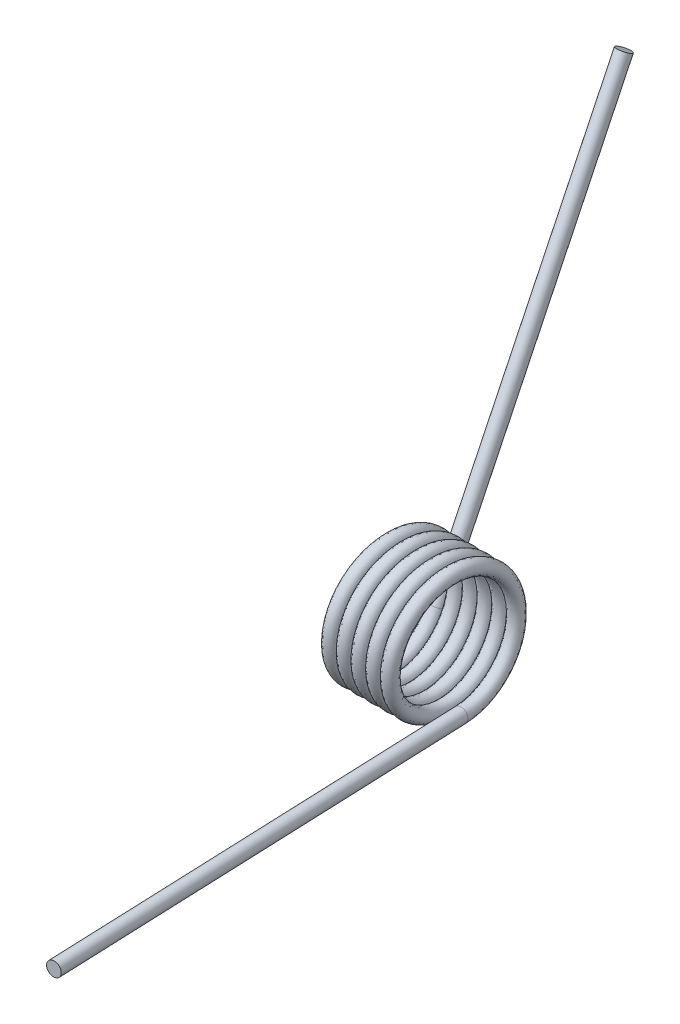
ISO-10303-21;
HEADER;
FILE_DESCRIPTION(('STEP AP214'),'2;1');
FILE_NAME('part.step','',(''),(''),'','','');
FILE_SCHEMA(('AUTOMOTIVE_DESIGN { 1 0 10303 214 1 1 1 1 }'));
ENDSEC;
DATA;
#1=APPLICATION_CONTEXT('core data for automotive mechanical design processes');
#2=APPLICATION_PROTOCOL_DEFINITION('international standard','automotive_design',2000,#1);
#3=PRODUCT_CONTEXT('',#1,'mechanical');
#4=PRODUCT('Part','Part','',(#3));
#5=PRODUCT_RELATED_PRODUCT_CATEGORY('part','',(#4));
#6=PRODUCT_DEFINITION_FORMATION('','',#4);
#7=PRODUCT_DEFINITION_CONTEXT('part definition',#1,'design');
#8=PRODUCT_DEFINITION('design','',#6,#7);
#9=PRODUCT_DEFINITION_SHAPE('','',#8);
#10=(LENGTH_UNIT() NAMED_UNIT(*) SI_UNIT(.MILLI.,.METRE.));
#11=(NAMED_UNIT(*) PLANE_ANGLE_UNIT() SI_UNIT($,.RADIAN.));
#12=(NAMED_UNIT(*) SI_UNIT($,.STERADIAN.) SOLID_ANGLE_UNIT());
#13=UNCERTAINTY_MEASURE_WITH_UNIT(LENGTH_MEASURE(1.E-05),#10,'distance_accuracy_value','');
#14=(GEOMETRIC_REPRESENTATION_CONTEXT(3) GLOBAL_UNCERTAINTY_ASSIGNED_CONTEXT((#13)) GLOBAL_UNIT_ASSIGNED_CONTEXT((#10,
#11,#12)) REPRESENTATION_CONTEXT('',''));
#15=CARTESIAN_POINT('',(0.,0.,0.));
#16=DIRECTION('',(0.,0.,1.));
#17=DIRECTION('',(1.,0.,0.));
#18=AXIS2_PLACEMENT_3D('',#15,#16,#17);
#19=CARTESIAN_POINT('',(-0.317253727132407,-2.667,0.0125029044863882));
#20=CARTESIAN_POINT('',(-0.37228706046574,-2.67421855527087,-1.52729026344234));
#21=CARTESIAN_POINT('',(-0.427320393799073,-1.3443278329063,-2.30343829964991));
#22=CARTESIAN_POINT('',(-0.482353727132406,-0.014437110541737,-3.07958633585747));
#23=CARTESIAN_POINT('',(-0.537387060465739,1.3226721670937,-2.31594120413629));
#24=CARTESIAN_POINT('',(-0.592420393799073,2.65978144472913,-1.55229607241512));
#25=CARTESIAN_POINT('',(-0.647453727132406,2.667,-0.0125029044863885));
#26=CARTESIAN_POINT('',(-0.702487060465739,2.67421855527087,1.52729026344234));
#27=CARTESIAN_POINT('',(-0.757520393799072,1.34432783290631,2.30343829964991));
#28=CARTESIAN_POINT('',(-0.812553727132405,0.0144371105417374,3.07958633585747));
#29=CARTESIAN_POINT('',(-0.867587060465739,-1.3226721670937,2.3159412041363));
#30=CARTESIAN_POINT('',(-0.922620393799072,-2.65978144472913,1.55229607241512));
#31=CARTESIAN_POINT('',(-0.977653727132405,-2.667,0.0125029044863882));
#32=CARTESIAN_POINT('',(-1.03268706046574,-2.67421855527087,-1.52729026344234));
#33=CARTESIAN_POINT('',(-1.08772039379907,-1.3443278329063,-2.30343829964991));
#34=CARTESIAN_POINT('',(-1.1427537271324,-0.014437110541737,-3.07958633585747));
#35=CARTESIAN_POINT('',(-1.19778706046574,1.3226721670937,-2.31594120413629));
#36=CARTESIAN_POINT('',(-1.25282039379907,2.65978144472913,-1.55229607241512));
#37=CARTESIAN_POINT('',(-1.3078537271324,2.667,-0.0125029044863885));
#38=CARTESIAN_POINT('',(-1.36288706046574,2.67421855527087,1.52729026344234));
#39=CARTESIAN_POINT('',(-1.41792039379907,1.34432783290631,2.30343829964991));
#40=CARTESIAN_POINT('',(-1.4729537271324,0.0144371105417374,3.07958633585747));
#41=CARTESIAN_POINT('',(-1.52798706046574,-1.3226721670937,2.3159412041363));
#42=CARTESIAN_POINT('',(-1.58302039379907,-2.65978144472913,1.55229607241512));
#43=CARTESIAN_POINT('',(-1.6380537271324,-2.667,0.0125029044863882));
#44=CARTESIAN_POINT('',(-1.69308706046574,-2.67421855527087,-1.52729026344234));
#45=CARTESIAN_POINT('',(-1.74812039379907,-1.3443278329063,-2.30343829964991));
#46=CARTESIAN_POINT('',(-1.8031537271324,-0.014437110541737,-3.07958633585747));
#47=CARTESIAN_POINT('',(-1.85818706046574,1.3226721670937,-2.31594120413629));
#48=CARTESIAN_POINT('',(-1.91322039379907,2.65978144472913,-1.55229607241512));
#49=CARTESIAN_POINT('',(-1.9682537271324,2.667,-0.0125029044863885));
#50=CARTESIAN_POINT('',(-2.02328706046574,2.67421855527087,1.52729026344234));
#51=CARTESIAN_POINT('',(-2.07832039379907,1.34432783290631,2.30343829964991));
#52=CARTESIAN_POINT('',(-2.1333537271324,0.0144371105417374,3.07958633585747));
#53=CARTESIAN_POINT('',(-2.18838706046574,-1.3226721670937,2.3159412041363));
#54=CARTESIAN_POINT('',(-2.24342039379907,-2.65978144472913,1.55229607241512));
#55=CARTESIAN_POINT('',(-2.2984537271324,-2.667,0.0125029044863882));
#56=CARTESIAN_POINT('',(-2.35348706046574,-2.67421855527087,-1.52729026344234));
#57=CARTESIAN_POINT('',(-2.40852039379907,-1.3443278329063,-2.30343829964991));
#58=CARTESIAN_POINT('',(-2.4635537271324,-0.014437110541737,-3.07958633585747));
#59=CARTESIAN_POINT('',(-2.51858706046573,1.3226721670937,-2.31594120413629));
#60=CARTESIAN_POINT('',(-2.57362039379907,2.65978144472913,-1.55229607241512));
#61=CARTESIAN_POINT('',(-2.6286537271324,2.667,-0.0125029044863885));
#62=CARTESIAN_POINT('',(-2.68368706046573,2.67421855527087,1.52729026344234));
#63=CARTESIAN_POINT('',(-2.73872039379907,1.34432783290631,2.30343829964991));
#64=CARTESIAN_POINT('',(-2.7937537271324,0.0144371105417374,3.07958633585747));
#65=CARTESIAN_POINT('',(-2.84878706046573,-1.3226721670937,2.3159412041363));
#66=CARTESIAN_POINT('',(-2.90382039379907,-2.65978144472913,1.55229607241512));
#67=CARTESIAN_POINT('',(-2.9588537271324,-2.667,0.0125029044863882));
#68=CARTESIAN_POINT('',(-3.01388706046573,-2.67421855527087,-1.52729026344234));
#69=CARTESIAN_POINT('',(-3.06892039379907,-1.3443278329063,-2.30343829964991));
#70=CARTESIAN_POINT('',(-3.1239537271324,-0.014437110541737,-3.07958633585747));
#71=CARTESIAN_POINT('',(-3.17898706046573,1.3226721670937,-2.31594120413629));
#72=CARTESIAN_POINT('',(-3.23402039379907,2.65978144472913,-1.55229607241512));
#73=CARTESIAN_POINT('',(-3.2890537271324,2.667,-0.0125029044863885));
#74=CARTESIAN_POINT('',(-3.34408706046573,2.67421855527087,1.52729026344234));
#75=CARTESIAN_POINT('',(-3.39912039379907,1.34432783290631,2.30343829964991));
#76=CARTESIAN_POINT('',(-3.4541537271324,0.0144371105417374,3.07958633585747));
#77=CARTESIAN_POINT('',(-3.50918706046573,-1.3226721670937,2.3159412041363));
#78=CARTESIAN_POINT('',(-3.56422039379907,-2.65978144472913,1.55229607241512));
#79=CARTESIAN_POINT('',(-3.6192537271324,-2.667,0.0125029044863882));
#80=CARTESIAN_POINT('',(-3.67428706046573,-2.67421855527087,-1.52729026344234));
#81=CARTESIAN_POINT('',(-3.72932039379906,-1.3443278329063,-2.30343829964991));
#82=CARTESIAN_POINT('',(-3.7843537271324,-0.014437110541737,-3.07958633585747));
#83=CARTESIAN_POINT('',(-3.83938706046573,1.3226721670937,-2.31594120413629));
#84=CARTESIAN_POINT('',(-3.89442039379906,2.65978144472913,-1.55229607241512));
#85=CARTESIAN_POINT('',(-3.9494537271324,2.667,-0.0125029044863885));
#86=CARTESIAN_POINT('',(-4.00448706046573,2.67421855527087,1.52729026344234));
#87=CARTESIAN_POINT('',(-4.05952039379906,1.34432783290631,2.30343829964991));
#88=CARTESIAN_POINT('',(-4.1145537271324,0.0144371105417374,3.07958633585747));
#89=CARTESIAN_POINT('',(-4.16958706046573,-1.3226721670937,2.3159412041363));
#90=CARTESIAN_POINT('',(-4.22462039379906,-2.65978144472913,1.55229607241512));
#91=CARTESIAN_POINT('',(-4.2796537271324,-2.667,0.0125029044863882));
#92=CARTESIAN_POINT('',(-0.317253727132406,-2.032,0.0125029044863945));
#93=CARTESIAN_POINT('',(-0.37228706046574,-2.03921855527087,-1.16067284250693));
#94=CARTESIAN_POINT('',(-0.427320393799073,-1.02682783290631,-1.75351216824678));
#95=CARTESIAN_POINT('',(-0.482353727132406,-0.0144371105417442,-2.34635149398664));
#96=CARTESIAN_POINT('',(-0.537387060465739,1.00517216709369,-1.76601507273318));
#97=CARTESIAN_POINT('',(-0.592420393799072,2.02478144472913,-1.18567865147972));
#98=CARTESIAN_POINT('',(-0.647453727132406,2.032,-0.0125029044863947));
#99=CARTESIAN_POINT('',(-0.702487060465739,2.03921855527088,1.16067284250693));
#100=CARTESIAN_POINT('',(-0.757520393799072,1.02682783290631,1.75351216824678));
#101=CARTESIAN_POINT('',(-0.812553727132405,0.0144371105417445,2.34635149398664));
#102=CARTESIAN_POINT('',(-0.867587060465738,-1.00517216709369,1.76601507273318));
#103=CARTESIAN_POINT('',(-0.922620393799072,-2.02478144472913,1.18567865147972));
#104=CARTESIAN_POINT('',(-0.977653727132405,-2.032,0.0125029044863945));
#105=CARTESIAN_POINT('',(-1.03268706046574,-2.03921855527087,-1.16067284250693));
#106=CARTESIAN_POINT('',(-1.08772039379907,-1.02682783290631,-1.75351216824678));
#107=CARTESIAN_POINT('',(-1.1427537271324,-0.0144371105417442,-2.34635149398664));
#108=CARTESIAN_POINT('',(-1.19778706046574,1.00517216709369,-1.76601507273318));
#109=CARTESIAN_POINT('',(-1.25282039379907,2.02478144472913,-1.18567865147972));
#110=CARTESIAN_POINT('',(-1.3078537271324,2.032,-0.0125029044863947));
#111=CARTESIAN_POINT('',(-1.36288706046574,2.03921855527088,1.16067284250693));
#112=CARTESIAN_POINT('',(-1.41792039379907,1.02682783290631,1.75351216824678));
#113=CARTESIAN_POINT('',(-1.4729537271324,0.0144371105417445,2.34635149398664));
#114=CARTESIAN_POINT('',(-1.52798706046574,-1.00517216709369,1.76601507273318));
#115=CARTESIAN_POINT('',(-1.58302039379907,-2.02478144472913,1.18567865147972));
#116=CARTESIAN_POINT('',(-1.6380537271324,-2.032,0.0125029044863945));
#117=CARTESIAN_POINT('',(-1.69308706046574,-2.03921855527087,-1.16067284250693));
#118=CARTESIAN_POINT('',(-1.74812039379907,-1.02682783290631,-1.75351216824678));
#119=CARTESIAN_POINT('',(-1.8031537271324,-0.0144371105417442,-2.34635149398664));
#120=CARTESIAN_POINT('',(-1.85818706046574,1.00517216709369,-1.76601507273318));
#121=CARTESIAN_POINT('',(-1.91322039379907,2.02478144472913,-1.18567865147972));
#122=CARTESIAN_POINT('',(-1.9682537271324,2.032,-0.0125029044863947));
#123=CARTESIAN_POINT('',(-2.02328706046574,2.03921855527088,1.16067284250693));
#124=CARTESIAN_POINT('',(-2.07832039379907,1.02682783290631,1.75351216824678));
#125=CARTESIAN_POINT('',(-2.1333537271324,0.0144371105417445,2.34635149398664));
#126=CARTESIAN_POINT('',(-2.18838706046574,-1.00517216709369,1.76601507273318));
#127=CARTESIAN_POINT('',(-2.24342039379907,-2.02478144472913,1.18567865147972));
#128=CARTESIAN_POINT('',(-2.2984537271324,-2.032,0.0125029044863945));
#129=CARTESIAN_POINT('',(-2.35348706046574,-2.03921855527087,-1.16067284250693));
#130=CARTESIAN_POINT('',(-2.40852039379907,-1.02682783290631,-1.75351216824678));
#131=CARTESIAN_POINT('',(-2.4635537271324,-0.0144371105417442,-2.34635149398664));
#132=CARTESIAN_POINT('',(-2.51858706046573,1.00517216709369,-1.76601507273318));
#133=CARTESIAN_POINT('',(-2.57362039379907,2.02478144472913,-1.18567865147972));
#134=CARTESIAN_POINT('',(-2.6286537271324,2.032,-0.0125029044863947));
#135=CARTESIAN_POINT('',(-2.68368706046573,2.03921855527088,1.16067284250693));
#136=CARTESIAN_POINT('',(-2.73872039379907,1.02682783290631,1.75351216824678));
#137=CARTESIAN_POINT('',(-2.7937537271324,0.0144371105417445,2.34635149398664));
#138=CARTESIAN_POINT('',(-2.84878706046573,-1.00517216709369,1.76601507273318));
#139=CARTESIAN_POINT('',(-2.90382039379907,-2.02478144472913,1.18567865147972));
#140=CARTESIAN_POINT('',(-2.9588537271324,-2.032,0.0125029044863945));
#141=CARTESIAN_POINT('',(-3.01388706046573,-2.03921855527087,-1.16067284250693));
#142=CARTESIAN_POINT('',(-3.06892039379907,-1.02682783290631,-1.75351216824678));
#143=CARTESIAN_POINT('',(-3.1239537271324,-0.0144371105417442,-2.34635149398664));
#144=CARTESIAN_POINT('',(-3.17898706046573,1.00517216709369,-1.76601507273318));
#145=CARTESIAN_POINT('',(-3.23402039379907,2.02478144472913,-1.18567865147972));
#146=CARTESIAN_POINT('',(-3.2890537271324,2.032,-0.0125029044863947));
#147=CARTESIAN_POINT('',(-3.34408706046573,2.03921855527088,1.16067284250693));
#148=CARTESIAN_POINT('',(-3.39912039379907,1.02682783290631,1.75351216824678));
#149=CARTESIAN_POINT('',(-3.4541537271324,0.0144371105417445,2.34635149398664));
#150=CARTESIAN_POINT('',(-3.50918706046573,-1.00517216709369,1.76601507273318));
#151=CARTESIAN_POINT('',(-3.56422039379906,-2.02478144472913,1.18567865147972));
#152=CARTESIAN_POINT('',(-3.6192537271324,-2.032,0.0125029044863945));
#153=CARTESIAN_POINT('',(-3.67428706046573,-2.03921855527087,-1.16067284250693));
#154=CARTESIAN_POINT('',(-3.72932039379906,-1.02682783290631,-1.75351216824678));
#155=CARTESIAN_POINT('',(-3.7843537271324,-0.0144371105417442,-2.34635149398664));
#156=CARTESIAN_POINT('',(-3.83938706046573,1.00517216709369,-1.76601507273318));
#157=CARTESIAN_POINT('',(-3.89442039379906,2.02478144472913,-1.18567865147972));
#158=CARTESIAN_POINT('',(-3.9494537271324,2.032,-0.0125029044863947));
#159=CARTESIAN_POINT('',(-4.00448706046573,2.03921855527088,1.16067284250693));
#160=CARTESIAN_POINT('',(-4.05952039379906,1.02682783290631,1.75351216824678));
#161=CARTESIAN_POINT('',(-4.1145537271324,0.0144371105417445,2.34635149398664));
#162=CARTESIAN_POINT('',(-4.16958706046573,-1.00517216709369,1.76601507273318));
#163=CARTESIAN_POINT('',(-4.22462039379906,-2.02478144472913,1.18567865147972));
#164=CARTESIAN_POINT('',(-4.2796537271324,-2.032,0.0125029044863945));
#165=CARTESIAN_POINT('',(0.317253727132407,-2.032,-0.0125029044864378));
#166=CARTESIAN_POINT('',(0.262220393799074,-2.02478144472911,-1.18567865147976));
#167=CARTESIAN_POINT('',(0.207187060465741,-1.00517216709366,-1.7660150727332));
#168=CARTESIAN_POINT('',(0.152153727132407,0.0144371105417939,-2.34635149398664));
#169=CARTESIAN_POINT('',(0.0971203937990741,1.02682783290635,-1.75351216824676));
#170=CARTESIAN_POINT('',(0.0420870604657409,2.0392185552709,-1.16067284250688));
#171=CARTESIAN_POINT('',(-0.0129462728675923,2.032,0.0125029044864375));
#172=CARTESIAN_POINT('',(-0.0679796062009255,2.02478144472911,1.18567865147976));
#173=CARTESIAN_POINT('',(-0.123012939534259,1.00517216709366,1.7660150727332));
#174=CARTESIAN_POINT('',(-0.178046272867592,-0.0144371105417936,2.34635149398664));
#175=CARTESIAN_POINT('',(-0.233079606200925,-1.02682783290635,1.75351216824676));
#176=CARTESIAN_POINT('',(-0.288112939534258,-2.0392185552709,1.16067284250688));
#177=CARTESIAN_POINT('',(-0.343146272867591,-2.032,-0.0125029044864378));
#178=CARTESIAN_POINT('',(-0.398179606200925,-2.02478144472911,-1.18567865147976));
#179=CARTESIAN_POINT('',(-0.453212939534258,-1.00517216709366,-1.7660150727332));
#180=CARTESIAN_POINT('',(-0.508246272867591,0.0144371105417939,-2.34635149398664));
#181=CARTESIAN_POINT('',(-0.563279606200924,1.02682783290635,-1.75351216824676));
#182=CARTESIAN_POINT('',(-0.618312939534257,2.0392185552709,-1.16067284250688));
#183=CARTESIAN_POINT('',(-0.673346272867591,2.032,0.0125029044864375));
#184=CARTESIAN_POINT('',(-0.728379606200924,2.02478144472911,1.18567865147976));
#185=CARTESIAN_POINT('',(-0.783412939534257,1.00517216709366,1.7660150727332));
#186=CARTESIAN_POINT('',(-0.83844627286759,-0.0144371105417936,2.34635149398664));
#187=CARTESIAN_POINT('',(-0.893479606200923,-1.02682783290635,1.75351216824676));
#188=CARTESIAN_POINT('',(-0.948512939534257,-2.0392185552709,1.16067284250688));
#189=CARTESIAN_POINT('',(-1.00354627286759,-2.032,-0.0125029044864378));
#190=CARTESIAN_POINT('',(-1.05857960620092,-2.02478144472911,-1.18567865147976));
#191=CARTESIAN_POINT('',(-1.11361293953426,-1.00517216709366,-1.7660150727332));
#192=CARTESIAN_POINT('',(-1.16864627286759,0.0144371105417939,-2.34635149398664));
#193=CARTESIAN_POINT('',(-1.22367960620092,1.02682783290635,-1.75351216824676));
#194=CARTESIAN_POINT('',(-1.27871293953426,2.0392185552709,-1.16067284250688));
#195=CARTESIAN_POINT('',(-1.33374627286759,2.032,0.0125029044864375));
#196=CARTESIAN_POINT('',(-1.38877960620092,2.02478144472911,1.18567865147976));
#197=CARTESIAN_POINT('',(-1.44381293953426,1.00517216709366,1.7660150727332));
#198=CARTESIAN_POINT('',(-1.49884627286759,-0.0144371105417936,2.34635149398664));
#199=CARTESIAN_POINT('',(-1.55387960620092,-1.02682783290635,1.75351216824676));
#200=CARTESIAN_POINT('',(-1.60891293953426,-2.0392185552709,1.16067284250688));
#201=CARTESIAN_POINT('',(-1.66394627286759,-2.032,-0.0125029044864378));
#202=CARTESIAN_POINT('',(-1.71897960620092,-2.02478144472911,-1.18567865147976));
#203=CARTESIAN_POINT('',(-1.77401293953425,-1.00517216709366,-1.7660150727332));
#204=CARTESIAN_POINT('',(-1.82904627286759,0.0144371105417939,-2.34635149398664));
#205=CARTESIAN_POINT('',(-1.88407960620092,1.02682783290635,-1.75351216824676));
#206=CARTESIAN_POINT('',(-1.93911293953425,2.0392185552709,-1.16067284250688));
#207=CARTESIAN_POINT('',(-1.99414627286759,2.032,0.0125029044864375));
#208=CARTESIAN_POINT('',(-2.04917960620092,2.02478144472911,1.18567865147976));
#209=CARTESIAN_POINT('',(-2.10421293953425,1.00517216709366,1.7660150727332));
#210=CARTESIAN_POINT('',(-2.15924627286759,-0.0144371105417936,2.34635149398664));
#211=CARTESIAN_POINT('',(-2.21427960620092,-1.02682783290635,1.75351216824676));
#212=CARTESIAN_POINT('',(-2.26931293953425,-2.0392185552709,1.16067284250688));
#213=CARTESIAN_POINT('',(-2.32434627286759,-2.032,-0.0125029044864378));
#214=CARTESIAN_POINT('',(-2.37937960620092,-2.02478144472911,-1.18567865147976));
#215=CARTESIAN_POINT('',(-2.43441293953425,-1.00517216709366,-1.7660150727332));
#216=CARTESIAN_POINT('',(-2.48944627286759,0.0144371105417939,-2.34635149398664));
#217=CARTESIAN_POINT('',(-2.54447960620092,1.02682783290635,-1.75351216824676));
#218=CARTESIAN_POINT('',(-2.59951293953425,2.0392185552709,-1.16067284250688));
#219=CARTESIAN_POINT('',(-2.65454627286759,2.032,0.0125029044864375));
#220=CARTESIAN_POINT('',(-2.70957960620092,2.02478144472911,1.18567865147976));
#221=CARTESIAN_POINT('',(-2.76461293953425,1.00517216709366,1.7660150727332));
#222=CARTESIAN_POINT('',(-2.81964627286759,-0.0144371105417936,2.34635149398664));
#223=CARTESIAN_POINT('',(-2.87467960620092,-1.02682783290635,1.75351216824676));
#224=CARTESIAN_POINT('',(-2.92971293953425,-2.0392185552709,1.16067284250688));
#225=CARTESIAN_POINT('',(-2.98474627286759,-2.032,-0.0125029044864378));
#226=CARTESIAN_POINT('',(-3.03977960620092,-2.02478144472911,-1.18567865147976));
#227=CARTESIAN_POINT('',(-3.09481293953425,-1.00517216709366,-1.7660150727332));
#228=CARTESIAN_POINT('',(-3.14984627286759,0.0144371105417939,-2.34635149398664));
#229=CARTESIAN_POINT('',(-3.20487960620092,1.02682783290635,-1.75351216824676));
#230=CARTESIAN_POINT('',(-3.25991293953425,2.0392185552709,-1.16067284250688));
#231=CARTESIAN_POINT('',(-3.31494627286758,2.032,0.0125029044864375));
#232=CARTESIAN_POINT('',(-3.36997960620092,2.02478144472911,1.18567865147976));
#233=CARTESIAN_POINT('',(-3.42501293953425,1.00517216709366,1.7660150727332));
#234=CARTESIAN_POINT('',(-3.48004627286758,-0.0144371105417936,2.34635149398664));
#235=CARTESIAN_POINT('',(-3.53507960620092,-1.02682783290635,1.75351216824676));
#236=CARTESIAN_POINT('',(-3.59011293953425,-2.0392185552709,1.16067284250688));
#237=CARTESIAN_POINT('',(-3.64514627286758,-2.032,-0.0125029044864378));
#238=CARTESIAN_POINT('',(0.317253727132407,-2.667,-0.0125029044864441));
#239=CARTESIAN_POINT('',(0.262220393799074,-2.6597814447291,-1.55229607241518));
#240=CARTESIAN_POINT('',(0.20718706046574,-1.32267216709365,-2.31594120413632));
#241=CARTESIAN_POINT('',(0.152153727132407,0.0144371105418011,-3.07958633585747));
#242=CARTESIAN_POINT('',(0.0971203937990739,1.34432783290635,-2.30343829964988));
#243=CARTESIAN_POINT('',(0.0420870604657408,2.6742185552709,-1.52729026344229));
#244=CARTESIAN_POINT('',(-0.0129462728675925,2.667,0.0125029044864437));
#245=CARTESIAN_POINT('',(-0.0679796062009257,2.6597814447291,1.55229607241518));
#246=CARTESIAN_POINT('',(-0.123012939534259,1.32267216709365,2.31594120413632));
#247=CARTESIAN_POINT('',(-0.178046272867592,-0.0144371105418007,3.07958633585747));
#248=CARTESIAN_POINT('',(-0.233079606200925,-1.34432783290635,2.30343829964988));
#249=CARTESIAN_POINT('',(-0.288112939534258,-2.6742185552709,1.52729026344229));
#250=CARTESIAN_POINT('',(-0.343146272867592,-2.667,-0.0125029044864441));
#251=CARTESIAN_POINT('',(-0.398179606200925,-2.6597814447291,-1.55229607241518));
#252=CARTESIAN_POINT('',(-0.453212939534258,-1.32267216709365,-2.31594120413632));
#253=CARTESIAN_POINT('',(-0.508246272867591,0.0144371105418011,-3.07958633585747));
#254=CARTESIAN_POINT('',(-0.563279606200924,1.34432783290635,-2.30343829964988));
#255=CARTESIAN_POINT('',(-0.618312939534258,2.6742185552709,-1.52729026344229));
#256=CARTESIAN_POINT('',(-0.673346272867591,2.667,0.0125029044864437));
#257=CARTESIAN_POINT('',(-0.728379606200924,2.6597814447291,1.55229607241518));
#258=CARTESIAN_POINT('',(-0.783412939534257,1.32267216709365,2.31594120413632));
#259=CARTESIAN_POINT('',(-0.83844627286759,-0.0144371105418007,3.07958633585747));
#260=CARTESIAN_POINT('',(-0.893479606200924,-1.34432783290635,2.30343829964988));
#261=CARTESIAN_POINT('',(-0.948512939534257,-2.6742185552709,1.52729026344229));
#262=CARTESIAN_POINT('',(-1.00354627286759,-2.667,-0.0125029044864441));
#263=CARTESIAN_POINT('',(-1.05857960620092,-2.6597814447291,-1.55229607241518));
#264=CARTESIAN_POINT('',(-1.11361293953426,-1.32267216709365,-2.31594120413632));
#265=CARTESIAN_POINT('',(-1.16864627286759,0.0144371105418011,-3.07958633585747));
#266=CARTESIAN_POINT('',(-1.22367960620092,1.34432783290635,-2.30343829964988));
#267=CARTESIAN_POINT('',(-1.27871293953426,2.6742185552709,-1.52729026344229));
#268=CARTESIAN_POINT('',(-1.33374627286759,2.667,0.0125029044864437));
#269=CARTESIAN_POINT('',(-1.38877960620092,2.6597814447291,1.55229607241518));
#270=CARTESIAN_POINT('',(-1.44381293953426,1.32267216709365,2.31594120413632));
#271=CARTESIAN_POINT('',(-1.49884627286759,-0.0144371105418007,3.07958633585747));
#272=CARTESIAN_POINT('',(-1.55387960620092,-1.34432783290635,2.30343829964988));
#273=CARTESIAN_POINT('',(-1.60891293953426,-2.6742185552709,1.52729026344229));
#274=CARTESIAN_POINT('',(-1.66394627286759,-2.667,-0.0125029044864441));
#275=CARTESIAN_POINT('',(-1.71897960620092,-2.6597814447291,-1.55229607241518));
#276=CARTESIAN_POINT('',(-1.77401293953425,-1.32267216709365,-2.31594120413632));
#277=CARTESIAN_POINT('',(-1.82904627286759,0.0144371105418011,-3.07958633585747));
#278=CARTESIAN_POINT('',(-1.88407960620092,1.34432783290635,-2.30343829964988));
#279=CARTESIAN_POINT('',(-1.93911293953425,2.6742185552709,-1.52729026344229));
#280=CARTESIAN_POINT('',(-1.99414627286759,2.667,0.0125029044864437));
#281=CARTESIAN_POINT('',(-2.04917960620092,2.6597814447291,1.55229607241518));
#282=CARTESIAN_POINT('',(-2.10421293953425,1.32267216709365,2.31594120413632));
#283=CARTESIAN_POINT('',(-2.15924627286759,-0.0144371105418007,3.07958633585747));
#284=CARTESIAN_POINT('',(-2.21427960620092,-1.34432783290635,2.30343829964988));
#285=CARTESIAN_POINT('',(-2.26931293953425,-2.6742185552709,1.52729026344229));
#286=CARTESIAN_POINT('',(-2.32434627286759,-2.667,-0.0125029044864441));
#287=CARTESIAN_POINT('',(-2.37937960620092,-2.6597814447291,-1.55229607241518));
#288=CARTESIAN_POINT('',(-2.43441293953425,-1.32267216709365,-2.31594120413632));
#289=CARTESIAN_POINT('',(-2.48944627286759,0.0144371105418011,-3.07958633585747));
#290=CARTESIAN_POINT('',(-2.54447960620092,1.34432783290635,-2.30343829964988));
#291=CARTESIAN_POINT('',(-2.59951293953425,2.6742185552709,-1.52729026344229));
#292=CARTESIAN_POINT('',(-2.65454627286759,2.667,0.0125029044864437));
#293=CARTESIAN_POINT('',(-2.70957960620092,2.6597814447291,1.55229607241518));
#294=CARTESIAN_POINT('',(-2.76461293953425,1.32267216709365,2.31594120413632));
#295=CARTESIAN_POINT('',(-2.81964627286759,-0.0144371105418007,3.07958633585747));
#296=CARTESIAN_POINT('',(-2.87467960620092,-1.34432783290635,2.30343829964988));
#297=CARTESIAN_POINT('',(-2.92971293953425,-2.6742185552709,1.52729026344229));
#298=CARTESIAN_POINT('',(-2.98474627286759,-2.667,-0.0125029044864441));
#299=CARTESIAN_POINT('',(-3.03977960620092,-2.6597814447291,-1.55229607241518));
#300=CARTESIAN_POINT('',(-3.09481293953425,-1.32267216709365,-2.31594120413632));
#301=CARTESIAN_POINT('',(-3.14984627286758,0.0144371105418011,-3.07958633585747));
#302=CARTESIAN_POINT('',(-3.20487960620092,1.34432783290635,-2.30343829964988));
#303=CARTESIAN_POINT('',(-3.25991293953425,2.6742185552709,-1.52729026344229));
#304=CARTESIAN_POINT('',(-3.31494627286758,2.667,0.0125029044864437));
#305=CARTESIAN_POINT('',(-3.36997960620092,2.6597814447291,1.55229607241518));
#306=CARTESIAN_POINT('',(-3.42501293953425,1.32267216709365,2.31594120413632));
#307=CARTESIAN_POINT('',(-3.48004627286758,-0.0144371105418007,3.07958633585747));
#308=CARTESIAN_POINT('',(-3.53507960620092,-1.34432783290635,2.30343829964988));
#309=CARTESIAN_POINT('',(-3.59011293953425,-2.6742185552709,1.52729026344229));
#310=CARTESIAN_POINT('',(-3.64514627286758,-2.667,-0.0125029044864441));
#311=CARTESIAN_POINT('',(0.317253727132407,-3.302,-0.0125029044864503));
#312=CARTESIAN_POINT('',(0.262220393799073,-3.2947814447291,-1.9189134933506));
#313=CARTESIAN_POINT('',(0.20718706046574,-1.64017216709365,-2.86586733553944));
#314=CARTESIAN_POINT('',(0.152153727132407,0.0144371105418083,-3.81282117772829));
#315=CARTESIAN_POINT('',(0.0971203937990738,1.66182783290636,-2.85336443105299));
#316=CARTESIAN_POINT('',(0.0420870604657406,3.30921855527091,-1.8939076843777));
#317=CARTESIAN_POINT('',(-0.0129462728675926,3.302,0.0125029044864499));
#318=CARTESIAN_POINT('',(-0.0679796062009258,3.2947814447291,1.9189134933506));
#319=CARTESIAN_POINT('',(-0.123012939534259,1.64017216709365,2.86586733553944));
#320=CARTESIAN_POINT('',(-0.178046272867592,-0.0144371105418079,3.81282117772829));
#321=CARTESIAN_POINT('',(-0.233079606200925,-1.66182783290636,2.853364431053));
#322=CARTESIAN_POINT('',(-0.288112939534259,-3.30921855527091,1.8939076843777));
#323=CARTESIAN_POINT('',(-0.343146272867592,-3.302,-0.0125029044864503));
#324=CARTESIAN_POINT('',(-0.398179606200925,-3.2947814447291,-1.9189134933506));
#325=CARTESIAN_POINT('',(-0.453212939534258,-1.64017216709365,-2.86586733553944));
#326=CARTESIAN_POINT('',(-0.508246272867591,0.0144371105418083,-3.81282117772829));
#327=CARTESIAN_POINT('',(-0.563279606200925,1.66182783290636,-2.85336443105299));
#328=CARTESIAN_POINT('',(-0.618312939534258,3.30921855527091,-1.8939076843777));
#329=CARTESIAN_POINT('',(-0.673346272867591,3.302,0.0125029044864499));
#330=CARTESIAN_POINT('',(-0.728379606200924,3.2947814447291,1.9189134933506));
#331=CARTESIAN_POINT('',(-0.783412939534257,1.64017216709365,2.86586733553944));
#332=CARTESIAN_POINT('',(-0.838446272867591,-0.0144371105418079,3.81282117772829));
#333=CARTESIAN_POINT('',(-0.893479606200924,-1.66182783290636,2.853364431053));
#334=CARTESIAN_POINT('',(-0.948512939534257,-3.30921855527091,1.8939076843777));
#335=CARTESIAN_POINT('',(-1.00354627286759,-3.302,-0.0125029044864503));
#336=CARTESIAN_POINT('',(-1.05857960620092,-3.2947814447291,-1.9189134933506));
#337=CARTESIAN_POINT('',(-1.11361293953426,-1.64017216709365,-2.86586733553944));
#338=CARTESIAN_POINT('',(-1.16864627286759,0.0144371105418083,-3.81282117772829));
#339=CARTESIAN_POINT('',(-1.22367960620092,1.66182783290636,-2.85336443105299));
#340=CARTESIAN_POINT('',(-1.27871293953426,3.30921855527091,-1.8939076843777));
#341=CARTESIAN_POINT('',(-1.33374627286759,3.302,0.0125029044864499));
#342=CARTESIAN_POINT('',(-1.38877960620092,3.2947814447291,1.9189134933506));
#343=CARTESIAN_POINT('',(-1.44381293953426,1.64017216709365,2.86586733553944));
#344=CARTESIAN_POINT('',(-1.49884627286759,-0.0144371105418079,3.81282117772829));
#345=CARTESIAN_POINT('',(-1.55387960620092,-1.66182783290636,2.853364431053));
#346=CARTESIAN_POINT('',(-1.60891293953426,-3.30921855527091,1.8939076843777));
#347=CARTESIAN_POINT('',(-1.66394627286759,-3.302,-0.0125029044864503));
#348=CARTESIAN_POINT('',(-1.71897960620092,-3.2947814447291,-1.9189134933506));
#349=CARTESIAN_POINT('',(-1.77401293953426,-1.64017216709365,-2.86586733553944));
#350=CARTESIAN_POINT('',(-1.82904627286759,0.0144371105418083,-3.81282117772829));
#351=CARTESIAN_POINT('',(-1.88407960620092,1.66182783290636,-2.85336443105299));
#352=CARTESIAN_POINT('',(-1.93911293953425,3.30921855527091,-1.8939076843777));
#353=CARTESIAN_POINT('',(-1.99414627286759,3.302,0.0125029044864499));
#354=CARTESIAN_POINT('',(-2.04917960620092,3.2947814447291,1.9189134933506));
#355=CARTESIAN_POINT('',(-2.10421293953425,1.64017216709365,2.86586733553944));
#356=CARTESIAN_POINT('',(-2.15924627286759,-0.0144371105418079,3.81282117772829));
#357=CARTESIAN_POINT('',(-2.21427960620092,-1.66182783290636,2.853364431053));
#358=CARTESIAN_POINT('',(-2.26931293953425,-3.30921855527091,1.8939076843777));
#359=CARTESIAN_POINT('',(-2.32434627286759,-3.302,-0.0125029044864503));
#360=CARTESIAN_POINT('',(-2.37937960620092,-3.2947814447291,-1.9189134933506));
#361=CARTESIAN_POINT('',(-2.43441293953425,-1.64017216709365,-2.86586733553944));
#362=CARTESIAN_POINT('',(-2.48944627286759,0.0144371105418083,-3.81282117772829));
#363=CARTESIAN_POINT('',(-2.54447960620092,1.66182783290636,-2.85336443105299));
#364=CARTESIAN_POINT('',(-2.59951293953425,3.30921855527091,-1.8939076843777));
#365=CARTESIAN_POINT('',(-2.65454627286759,3.302,0.0125029044864499));
#366=CARTESIAN_POINT('',(-2.70957960620092,3.2947814447291,1.9189134933506));
#367=CARTESIAN_POINT('',(-2.76461293953425,1.64017216709365,2.86586733553944));
#368=CARTESIAN_POINT('',(-2.81964627286759,-0.0144371105418079,3.81282117772829));
#369=CARTESIAN_POINT('',(-2.87467960620092,-1.66182783290636,2.853364431053));
#370=CARTESIAN_POINT('',(-2.92971293953425,-3.30921855527091,1.8939076843777));
#371=CARTESIAN_POINT('',(-2.98474627286759,-3.302,-0.0125029044864503));
#372=CARTESIAN_POINT('',(-3.03977960620092,-3.2947814447291,-1.9189134933506));
#373=CARTESIAN_POINT('',(-3.09481293953425,-1.64017216709365,-2.86586733553944));
#374=CARTESIAN_POINT('',(-3.14984627286759,0.0144371105418083,-3.81282117772829));
#375=CARTESIAN_POINT('',(-3.20487960620092,1.66182783290636,-2.85336443105299));
#376=CARTESIAN_POINT('',(-3.25991293953425,3.30921855527091,-1.8939076843777));
#377=CARTESIAN_POINT('',(-3.31494627286758,3.302,0.0125029044864499));
#378=CARTESIAN_POINT('',(-3.36997960620092,3.2947814447291,1.9189134933506));
#379=CARTESIAN_POINT('',(-3.42501293953425,1.64017216709365,2.86586733553944));
#380=CARTESIAN_POINT('',(-3.48004627286758,-0.0144371105418079,3.81282117772829));
#381=CARTESIAN_POINT('',(-3.53507960620092,-1.66182783290636,2.853364431053));
#382=CARTESIAN_POINT('',(-3.59011293953425,-3.30921855527091,1.8939076843777));
#383=CARTESIAN_POINT('',(-3.64514627286758,-3.302,-0.0125029044864503));
#384=CARTESIAN_POINT('',(-0.317253727132407,-3.302,0.0125029044863819));
#385=CARTESIAN_POINT('',(-0.37228706046574,-3.30921855527087,-1.89390768437776));
#386=CARTESIAN_POINT('',(-0.427320393799073,-1.6618278329063,-2.85336443105303));
#387=CARTESIAN_POINT('',(-0.482353727132407,-0.0144371105417298,-3.81282117772829));
#388=CARTESIAN_POINT('',(-0.53738706046574,1.6401721670937,-2.86586733553941));
#389=CARTESIAN_POINT('',(-0.592420393799073,3.29478144472914,-1.91891349335053));
#390=CARTESIAN_POINT('',(-0.647453727132406,3.302,-0.0125029044863823));
#391=CARTESIAN_POINT('',(-0.702487060465739,3.30921855527087,1.89390768437776));
#392=CARTESIAN_POINT('',(-0.757520393799073,1.6618278329063,2.85336443105303));
#393=CARTESIAN_POINT('',(-0.812553727132406,0.0144371105417302,3.81282117772829));
#394=CARTESIAN_POINT('',(-0.867587060465739,-1.6401721670937,2.86586733553941));
#395=CARTESIAN_POINT('',(-0.922620393799072,-3.29478144472914,1.91891349335053));
#396=CARTESIAN_POINT('',(-0.977653727132405,-3.302,0.0125029044863819));
#397=CARTESIAN_POINT('',(-1.03268706046574,-3.30921855527087,-1.89390768437776));
#398=CARTESIAN_POINT('',(-1.08772039379907,-1.6618278329063,-2.85336443105303));
#399=CARTESIAN_POINT('',(-1.1427537271324,-0.0144371105417298,-3.81282117772829));
#400=CARTESIAN_POINT('',(-1.19778706046574,1.6401721670937,-2.86586733553941));
#401=CARTESIAN_POINT('',(-1.25282039379907,3.29478144472914,-1.91891349335053));
#402=CARTESIAN_POINT('',(-1.3078537271324,3.302,-0.0125029044863823));
#403=CARTESIAN_POINT('',(-1.36288706046574,3.30921855527087,1.89390768437776));
#404=CARTESIAN_POINT('',(-1.41792039379907,1.6618278329063,2.85336443105303));
#405=CARTESIAN_POINT('',(-1.4729537271324,0.0144371105417302,3.81282117772829));
#406=CARTESIAN_POINT('',(-1.52798706046574,-1.6401721670937,2.86586733553941));
#407=CARTESIAN_POINT('',(-1.58302039379907,-3.29478144472914,1.91891349335053));
#408=CARTESIAN_POINT('',(-1.6380537271324,-3.302,0.0125029044863819));
#409=CARTESIAN_POINT('',(-1.69308706046574,-3.30921855527087,-1.89390768437776));
#410=CARTESIAN_POINT('',(-1.74812039379907,-1.6618278329063,-2.85336443105303));
#411=CARTESIAN_POINT('',(-1.8031537271324,-0.0144371105417298,-3.81282117772829));
#412=CARTESIAN_POINT('',(-1.85818706046574,1.6401721670937,-2.86586733553941));
#413=CARTESIAN_POINT('',(-1.91322039379907,3.29478144472914,-1.91891349335053));
#414=CARTESIAN_POINT('',(-1.9682537271324,3.302,-0.0125029044863823));
#415=CARTESIAN_POINT('',(-2.02328706046574,3.30921855527087,1.89390768437776));
#416=CARTESIAN_POINT('',(-2.07832039379907,1.6618278329063,2.85336443105303));
#417=CARTESIAN_POINT('',(-2.1333537271324,0.0144371105417302,3.81282117772829));
#418=CARTESIAN_POINT('',(-2.18838706046574,-1.6401721670937,2.86586733553941));
#419=CARTESIAN_POINT('',(-2.24342039379907,-3.29478144472914,1.91891349335053));
#420=CARTESIAN_POINT('',(-2.2984537271324,-3.302,0.0125029044863819));
#421=CARTESIAN_POINT('',(-2.35348706046574,-3.30921855527087,-1.89390768437776));
#422=CARTESIAN_POINT('',(-2.40852039379907,-1.6618278329063,-2.85336443105303));
#423=CARTESIAN_POINT('',(-2.4635537271324,-0.0144371105417298,-3.81282117772829));
#424=CARTESIAN_POINT('',(-2.51858706046573,1.6401721670937,-2.86586733553941));
#425=CARTESIAN_POINT('',(-2.57362039379907,3.29478144472914,-1.91891349335053));
#426=CARTESIAN_POINT('',(-2.6286537271324,3.302,-0.0125029044863823));
#427=CARTESIAN_POINT('',(-2.68368706046574,3.30921855527087,1.89390768437776));
#428=CARTESIAN_POINT('',(-2.73872039379907,1.6618278329063,2.85336443105303));
#429=CARTESIAN_POINT('',(-2.7937537271324,0.0144371105417302,3.81282117772829));
#430=CARTESIAN_POINT('',(-2.84878706046573,-1.6401721670937,2.86586733553941));
#431=CARTESIAN_POINT('',(-2.90382039379907,-3.29478144472914,1.91891349335053));
#432=CARTESIAN_POINT('',(-2.9588537271324,-3.302,0.0125029044863819));
#433=CARTESIAN_POINT('',(-3.01388706046573,-3.30921855527087,-1.89390768437776));
#434=CARTESIAN_POINT('',(-3.06892039379907,-1.6618278329063,-2.85336443105303));
#435=CARTESIAN_POINT('',(-3.1239537271324,-0.0144371105417298,-3.81282117772829));
#436=CARTESIAN_POINT('',(-3.17898706046573,1.6401721670937,-2.86586733553941));
#437=CARTESIAN_POINT('',(-3.23402039379907,3.29478144472914,-1.91891349335053));
#438=CARTESIAN_POINT('',(-3.2890537271324,3.302,-0.0125029044863823));
#439=CARTESIAN_POINT('',(-3.34408706046573,3.30921855527087,1.89390768437776));
#440=CARTESIAN_POINT('',(-3.39912039379907,1.6618278329063,2.85336443105303));
#441=CARTESIAN_POINT('',(-3.4541537271324,0.0144371105417302,3.81282117772829));
#442=CARTESIAN_POINT('',(-3.50918706046573,-1.6401721670937,2.86586733553941));
#443=CARTESIAN_POINT('',(-3.56422039379907,-3.29478144472914,1.91891349335053));
#444=CARTESIAN_POINT('',(-3.6192537271324,-3.302,0.0125029044863819));
#445=CARTESIAN_POINT('',(-3.67428706046573,-3.30921855527087,-1.89390768437776));
#446=CARTESIAN_POINT('',(-3.72932039379907,-1.6618278329063,-2.85336443105303));
#447=CARTESIAN_POINT('',(-3.7843537271324,-0.0144371105417298,-3.81282117772829));
#448=CARTESIAN_POINT('',(-3.83938706046573,1.6401721670937,-2.86586733553941));
#449=CARTESIAN_POINT('',(-3.89442039379906,3.29478144472914,-1.91891349335053));
#450=CARTESIAN_POINT('',(-3.9494537271324,3.302,-0.0125029044863823));
#451=CARTESIAN_POINT('',(-4.00448706046573,3.30921855527087,1.89390768437776));
#452=CARTESIAN_POINT('',(-4.05952039379906,1.6618278329063,2.85336443105303));
#453=CARTESIAN_POINT('',(-4.1145537271324,0.0144371105417302,3.81282117772829));
#454=CARTESIAN_POINT('',(-4.16958706046573,-1.6401721670937,2.86586733553941));
#455=CARTESIAN_POINT('',(-4.22462039379906,-3.29478144472914,1.91891349335053));
#456=CARTESIAN_POINT('',(-4.2796537271324,-3.302,0.0125029044863819));
#457=CARTESIAN_POINT('',(-0.317253727132407,-2.667,0.0125029044863882));
#458=CARTESIAN_POINT('',(-0.37228706046574,-2.67421855527087,-1.52729026344234));
#459=CARTESIAN_POINT('',(-0.427320393799073,-1.3443278329063,-2.30343829964991));
#460=CARTESIAN_POINT('',(-0.482353727132406,-0.014437110541737,-3.07958633585747));
#461=CARTESIAN_POINT('',(-0.537387060465739,1.3226721670937,-2.31594120413629));
#462=CARTESIAN_POINT('',(-0.592420393799073,2.65978144472913,-1.55229607241512));
#463=CARTESIAN_POINT('',(-0.647453727132406,2.667,-0.0125029044863885));
#464=CARTESIAN_POINT('',(-0.702487060465739,2.67421855527087,1.52729026344234));
#465=CARTESIAN_POINT('',(-0.757520393799072,1.34432783290631,2.30343829964991));
#466=CARTESIAN_POINT('',(-0.812553727132405,0.0144371105417374,3.07958633585747));
#467=CARTESIAN_POINT('',(-0.867587060465739,-1.3226721670937,2.3159412041363));
#468=CARTESIAN_POINT('',(-0.922620393799072,-2.65978144472913,1.55229607241512));
#469=CARTESIAN_POINT('',(-0.977653727132405,-2.667,0.0125029044863882));
#470=CARTESIAN_POINT('',(-1.03268706046574,-2.67421855527087,-1.52729026344234));
#471=CARTESIAN_POINT('',(-1.08772039379907,-1.3443278329063,-2.30343829964991));
#472=CARTESIAN_POINT('',(-1.1427537271324,-0.014437110541737,-3.07958633585747));
#473=CARTESIAN_POINT('',(-1.19778706046574,1.3226721670937,-2.31594120413629));
#474=CARTESIAN_POINT('',(-1.25282039379907,2.65978144472913,-1.55229607241512));
#475=CARTESIAN_POINT('',(-1.3078537271324,2.667,-0.0125029044863885));
#476=CARTESIAN_POINT('',(-1.36288706046574,2.67421855527087,1.52729026344234));
#477=CARTESIAN_POINT('',(-1.41792039379907,1.34432783290631,2.30343829964991));
#478=CARTESIAN_POINT('',(-1.4729537271324,0.0144371105417374,3.07958633585747));
#479=CARTESIAN_POINT('',(-1.52798706046574,-1.3226721670937,2.3159412041363));
#480=CARTESIAN_POINT('',(-1.58302039379907,-2.65978144472913,1.55229607241512));
#481=CARTESIAN_POINT('',(-1.6380537271324,-2.667,0.0125029044863882));
#482=CARTESIAN_POINT('',(-1.69308706046574,-2.67421855527087,-1.52729026344234));
#483=CARTESIAN_POINT('',(-1.74812039379907,-1.3443278329063,-2.30343829964991));
#484=CARTESIAN_POINT('',(-1.8031537271324,-0.014437110541737,-3.07958633585747));
#485=CARTESIAN_POINT('',(-1.85818706046574,1.3226721670937,-2.31594120413629));
#486=CARTESIAN_POINT('',(-1.91322039379907,2.65978144472913,-1.55229607241512));
#487=CARTESIAN_POINT('',(-1.9682537271324,2.667,-0.0125029044863885));
#488=CARTESIAN_POINT('',(-2.02328706046574,2.67421855527087,1.52729026344234));
#489=CARTESIAN_POINT('',(-2.07832039379907,1.34432783290631,2.30343829964991));
#490=CARTESIAN_POINT('',(-2.1333537271324,0.0144371105417374,3.07958633585747));
#491=CARTESIAN_POINT('',(-2.18838706046574,-1.3226721670937,2.3159412041363));
#492=CARTESIAN_POINT('',(-2.24342039379907,-2.65978144472913,1.55229607241512));
#493=CARTESIAN_POINT('',(-2.2984537271324,-2.667,0.0125029044863882));
#494=CARTESIAN_POINT('',(-2.35348706046574,-2.67421855527087,-1.52729026344234));
#495=CARTESIAN_POINT('',(-2.40852039379907,-1.3443278329063,-2.30343829964991));
#496=CARTESIAN_POINT('',(-2.4635537271324,-0.014437110541737,-3.07958633585747));
#497=CARTESIAN_POINT('',(-2.51858706046573,1.3226721670937,-2.31594120413629));
#498=CARTESIAN_POINT('',(-2.57362039379907,2.65978144472913,-1.55229607241512));
#499=CARTESIAN_POINT('',(-2.6286537271324,2.667,-0.0125029044863885));
#500=CARTESIAN_POINT('',(-2.68368706046573,2.67421855527087,1.52729026344234));
#501=CARTESIAN_POINT('',(-2.73872039379907,1.34432783290631,2.30343829964991));
#502=CARTESIAN_POINT('',(-2.7937537271324,0.0144371105417374,3.07958633585747));
#503=CARTESIAN_POINT('',(-2.84878706046573,-1.3226721670937,2.3159412041363));
#504=CARTESIAN_POINT('',(-2.90382039379907,-2.65978144472913,1.55229607241512));
#505=CARTESIAN_POINT('',(-2.9588537271324,-2.667,0.0125029044863882));
#506=CARTESIAN_POINT('',(-3.01388706046573,-2.67421855527087,-1.52729026344234));
#507=CARTESIAN_POINT('',(-3.06892039379907,-1.3443278329063,-2.30343829964991));
#508=CARTESIAN_POINT('',(-3.1239537271324,-0.014437110541737,-3.07958633585747));
#509=CARTESIAN_POINT('',(-3.17898706046573,1.3226721670937,-2.31594120413629));
#510=CARTESIAN_POINT('',(-3.23402039379907,2.65978144472913,-1.55229607241512));
#511=CARTESIAN_POINT('',(-3.2890537271324,2.667,-0.0125029044863885));
#512=CARTESIAN_POINT('',(-3.34408706046573,2.67421855527087,1.52729026344234));
#513=CARTESIAN_POINT('',(-3.39912039379907,1.34432783290631,2.30343829964991));
#514=CARTESIAN_POINT('',(-3.4541537271324,0.0144371105417374,3.07958633585747));
#515=CARTESIAN_POINT('',(-3.50918706046573,-1.3226721670937,2.3159412041363));
#516=CARTESIAN_POINT('',(-3.56422039379907,-2.65978144472913,1.55229607241512));
#517=CARTESIAN_POINT('',(-3.6192537271324,-2.667,0.0125029044863882));
#518=CARTESIAN_POINT('',(-3.67428706046573,-2.67421855527087,-1.52729026344234));
#519=CARTESIAN_POINT('',(-3.72932039379906,-1.3443278329063,-2.30343829964991));
#520=CARTESIAN_POINT('',(-3.7843537271324,-0.014437110541737,-3.07958633585747));
#521=CARTESIAN_POINT('',(-3.83938706046573,1.3226721670937,-2.31594120413629));
#522=CARTESIAN_POINT('',(-3.89442039379906,2.65978144472913,-1.55229607241512));
#523=CARTESIAN_POINT('',(-3.9494537271324,2.667,-0.0125029044863885));
#524=CARTESIAN_POINT('',(-4.00448706046573,2.67421855527087,1.52729026344234));
#525=CARTESIAN_POINT('',(-4.05952039379906,1.34432783290631,2.30343829964991));
#526=CARTESIAN_POINT('',(-4.1145537271324,0.0144371105417374,3.07958633585747));
#527=CARTESIAN_POINT('',(-4.16958706046573,-1.3226721670937,2.3159412041363));
#528=CARTESIAN_POINT('',(-4.22462039379906,-2.65978144472913,1.55229607241512));
#529=CARTESIAN_POINT('',(-4.2796537271324,-2.667,0.0125029044863882));
#530=(BOUNDED_SURFACE() B_SPLINE_SURFACE(3,2,((#19,#20,#21,#22,#23,#24,#25,#26,#27,#28,#29,#30,
#31,#32,#33,#34,#35,#36,#37,#38,#39,#40,#41,#42,#43,#44,#45,#46,#47,#48,#49,#50,#51,#52,#53,#54,
#55,#56,#57,#58,#59,#60,#61,#62,#63,#64,#65,#66,#67,#68,#69,#70,#71,#72,#73,#74,#75,#76,#77,#78,
#79,#80,#81,#82,#83,#84,#85,#86,#87,#88,#89,#90,#91),(#92,#93,#94,#95,#96,#97,#98,#99,#100,#101,
#102,#103,#104,#105,#106,#107,#108,#109,#110,#111,#112,#113,#114,#115,#116,#117,#118,#119,#120,
#121,#122,#123,#124,#125,#126,#127,#128,#129,#130,#131,#132,#133,#134,#135,#136,#137,#138,#139,
#140,#141,#142,#143,#144,#145,#146,#147,#148,#149,#150,#151,#152,#153,#154,#155,#156,#157,#158,
#159,#160,#161,#162,#163,#164),(#165,#166,#167,#168,#169,#170,#171,#172,#173,#174,#175,#176,
#177,#178,#179,#180,#181,#182,#183,#184,#185,#186,#187,#188,#189,#190,#191,#192,#193,#194,#195,
#196,#197,#198,#199,#200,#201,#202,#203,#204,#205,#206,#207,#208,#209,#210,#211,#212,#213,#214,
#215,#216,#217,#218,#219,#220,#221,#222,#223,#224,#225,#226,#227,#228,#229,#230,#231,#232,#233,
#234,#235,#236,#237),(#238,#239,#240,#241,#242,#243,#244,#245,#246,#247,#248,#249,#250,#251,
#252,#253,#254,#255,#256,#257,#258,#259,#260,#261,#262,#263,#264,#265,#266,#267,#268,#269,#270,
#271,#272,#273,#274,#275,#276,#277,#278,#279,#280,#281,#282,#283,#284,#285,#286,#287,#288,#289,
#290,#291,#292,#293,#294,#295,#296,#297,#298,#299,#300,#301,#302,#303,#304,#305,#306,#307,#308,
#309,#310),(#311,#312,#313,#314,#315,#316,#317,#318,#319,#320,#321,#322,#323,#324,#325,#326,
#327,#328,#329,#330,#331,#332,#333,#334,#335,#336,#337,#338,#339,#340,#341,#342,#343,#344,#345,
#346,#347,#348,#349,#350,#351,#352,#353,#354,#355,#356,#357,#358,#359,#360,#361,#362,#363,#364,
#365,#366,#367,#368,#369,#370,#371,#372,#373,#374,#375,#376,#377,#378,#379,#380,#381,#382,#383),
(#384,#385,#386,#387,#388,#389,#390,#391,#392,#393,#394,#395,#396,#397,#398,#399,#400,#401,#402,
#403,#404,#405,#406,#407,#408,#409,#410,#411,#412,#413,#414,#415,#416,#417,#418,#419,#420,#421,
#422,#423,#424,#425,#426,#427,#428,#429,#430,#431,#432,#433,#434,#435,#436,#437,#438,#439,#440,
#441,#442,#443,#444,#445,#446,#447,#448,#449,#450,#451,#452,#453,#454,#455,#456),(#457,#458,
#459,#460,#461,#462,#463,#464,#465,#466,#467,#468,#469,#470,#471,#472,#473,#474,#475,#476,#477,
#478,#479,#480,#481,#482,#483,#484,#485,#486,#487,#488,#489,#490,#491,#492,#493,#494,#495,#496,
#497,#498,#499,#500,#501,#502,#503,#504,#505,#506,#507,#508,#509,#510,#511,#512,#513,#514,#515,
#516,#517,#518,#519,#520,#521,#522,#523,#524,#525,#526,#527,#528,#529)),.UNSPECIFIED.,.T.,.F.,
.F.) B_SPLINE_SURFACE_WITH_KNOTS((4,3,4),(3,2,2,2,2,2,2,2,2,2,2,2,2,2,2,2,2,2,2,2,2,2,2,2,2,2,2,
2,2,2,2,2,2,2,2,2,3),(0.,0.5,1.),(0.,0.0277777777777778,0.0555555555555556,0.0833333333333333,
0.111111111111111,0.138888888888889,0.166666666666667,0.194444444444444,0.222222222222222,0.25,
0.277777777777778,0.305555555555556,0.333333333333333,0.361111111111111,0.388888888888889,
0.416666666666667,0.444444444444444,0.472222222222222,0.5,0.527777777777778,0.555555555555556,
0.583333333333333,0.611111111111111,0.638888888888889,0.666666666666667,0.694444444444444,
0.722222222222222,0.75,0.777777777777778,0.805555555555556,0.833333333333333,0.861111111111111,
0.888888888888889,0.916666666666667,0.944444444444444,0.972222222222222,1.),
.UNSPECIFIED.) GEOMETRIC_REPRESENTATION_ITEM() RATIONAL_B_SPLINE_SURFACE(((1.,0.866025403784439,
1.,0.866025403784439,1.,0.866025403784439,1.,0.866025403784439,1.,0.866025403784439,1.,
0.866025403784439,1.,0.866025403784439,1.,0.866025403784439,1.,0.866025403784439,1.,
0.866025403784439,1.,0.866025403784439,1.,0.866025403784439,1.,0.866025403784439,1.,
0.866025403784439,1.,0.866025403784439,1.,0.866025403784439,1.,0.866025403784439,1.,
0.866025403784439,1.,0.866025403784439,1.,0.866025403784439,1.,0.866025403784439,1.,
0.866025403784439,1.,0.866025403784439,1.,0.866025403784439,1.,0.866025403784439,1.,
0.866025403784439,1.,0.866025403784439,1.,0.866025403784439,1.,0.866025403784439,1.,
0.866025403784439,1.,0.866025403784439,1.,0.866025403784439,1.,0.866025403784439,1.,
0.866025403784439,1.,0.866025403784439,1.,0.866025403784439,1.),(0.333333333333333,
0.288675134594813,0.333333333333333,0.288675134594813,0.333333333333333,0.288675134594813,
0.333333333333333,0.288675134594813,0.333333333333333,0.288675134594813,0.333333333333333,
0.288675134594813,0.333333333333333,0.288675134594813,0.333333333333333,0.288675134594813,
0.333333333333333,0.288675134594813,0.333333333333333,0.288675134594813,0.333333333333333,
0.288675134594813,0.333333333333333,0.288675134594813,0.333333333333333,0.288675134594813,
0.333333333333333,0.288675134594813,0.333333333333333,0.288675134594813,0.333333333333333,
0.288675134594813,0.333333333333333,0.288675134594813,0.333333333333333,0.288675134594813,
0.333333333333333,0.288675134594813,0.333333333333333,0.288675134594813,0.333333333333333,
0.288675134594813,0.333333333333333,0.288675134594813,0.333333333333333,0.288675134594813,
0.333333333333333,0.288675134594813,0.333333333333333,0.288675134594813,0.333333333333333,
0.288675134594813,0.333333333333333,0.288675134594813,0.333333333333333,0.288675134594813,
0.333333333333333,0.288675134594813,0.333333333333333,0.288675134594813,0.333333333333333,
0.288675134594813,0.333333333333333,0.288675134594813,0.333333333333333,0.288675134594813,
0.333333333333333,0.288675134594813,0.333333333333333,0.288675134594813,0.333333333333333,
0.288675134594813,0.333333333333333),(0.333333333333333,0.288675134594813,0.333333333333333,
0.288675134594813,0.333333333333333,0.288675134594813,0.333333333333333,0.288675134594813,
0.333333333333333,0.288675134594813,0.333333333333333,0.288675134594813,0.333333333333333,
0.288675134594813,0.333333333333333,0.288675134594813,0.333333333333333,0.288675134594813,
0.333333333333333,0.288675134594813,0.333333333333333,0.288675134594813,0.333333333333333,
0.288675134594813,0.333333333333333,0.288675134594813,0.333333333333333,0.288675134594813,
0.333333333333333,0.288675134594813,0.333333333333333,0.288675134594813,0.333333333333333,
0.288675134594813,0.333333333333333,0.288675134594813,0.333333333333333,0.288675134594813,
0.333333333333333,0.288675134594813,0.333333333333333,0.288675134594813,0.333333333333333,
0.288675134594813,0.333333333333333,0.288675134594813,0.333333333333333,0.288675134594813,
0.333333333333333,0.288675134594813,0.333333333333333,0.288675134594813,0.333333333333333,
0.288675134594813,0.333333333333333,0.288675134594813,0.333333333333333,0.288675134594813,
0.333333333333333,0.288675134594813,0.333333333333333,0.288675134594813,0.333333333333333,
0.288675134594813,0.333333333333333,0.288675134594813,0.333333333333333,0.288675134594813,
0.333333333333333,0.288675134594813,0.333333333333333,0.288675134594813,0.333333333333333),(1.,
0.866025403784439,1.,0.866025403784439,1.,0.866025403784439,1.,0.866025403784439,1.,
0.866025403784439,1.,0.866025403784439,1.,0.866025403784439,1.,0.866025403784439,1.,
0.866025403784439,1.,0.866025403784439,1.,0.866025403784439,1.,0.866025403784439,1.,
0.866025403784439,1.,0.866025403784439,1.,0.866025403784439,1.,0.866025403784439,1.,
0.866025403784439,1.,0.866025403784439,1.,0.866025403784439,1.,0.866025403784439,1.,
0.866025403784439,1.,0.866025403784439,1.,0.866025403784439,1.,0.866025403784439,1.,
0.866025403784439,1.,0.866025403784439,1.,0.866025403784439,1.,0.866025403784439,1.,
0.866025403784439,1.,0.866025403784439,1.,0.866025403784439,1.,0.866025403784439,1.,
0.866025403784439,1.,0.866025403784439,1.,0.866025403784439,1.,0.866025403784439,1.),
(0.333333333333333,0.288675134594813,0.333333333333333,0.288675134594813,0.333333333333333,
0.288675134594813,0.333333333333333,0.288675134594813,0.333333333333333,0.288675134594813,
0.333333333333333,0.288675134594813,0.333333333333333,0.288675134594813,0.333333333333333,
0.288675134594813,0.333333333333333,0.288675134594813,0.333333333333333,0.288675134594813,
0.333333333333333,0.288675134594813,0.333333333333333,0.288675134594813,0.333333333333333,
0.288675134594813,0.333333333333333,0.288675134594813,0.333333333333333,0.288675134594813,
0.333333333333333,0.288675134594813,0.333333333333333,0.288675134594813,0.333333333333333,
0.288675134594813,0.333333333333333,0.288675134594813,0.333333333333333,0.288675134594813,
0.333333333333333,0.288675134594813,0.333333333333333,0.288675134594813,0.333333333333333,
0.288675134594813,0.333333333333333,0.288675134594813,0.333333333333333,0.288675134594813,
0.333333333333333,0.288675134594813,0.333333333333333,0.288675134594813,0.333333333333333,
0.288675134594813,0.333333333333333,0.288675134594813,0.333333333333333,0.288675134594813,
0.333333333333333,0.288675134594813,0.333333333333333,0.288675134594813,0.333333333333333,
0.288675134594813,0.333333333333333,0.288675134594813,0.333333333333333,0.288675134594813,
0.333333333333333,0.288675134594813,0.333333333333333),(0.333333333333333,0.288675134594813,
0.333333333333333,0.288675134594813,0.333333333333333,0.288675134594813,0.333333333333333,
0.288675134594813,0.333333333333333,0.288675134594813,0.333333333333333,0.288675134594813,
0.333333333333333,0.288675134594813,0.333333333333333,0.288675134594813,0.333333333333333,
0.288675134594813,0.333333333333333,0.288675134594813,0.333333333333333,0.288675134594813,
0.333333333333333,0.288675134594813,0.333333333333333,0.288675134594813,0.333333333333333,
0.288675134594813,0.333333333333333,0.288675134594813,0.333333333333333,0.288675134594813,
0.333333333333333,0.288675134594813,0.333333333333333,0.288675134594813,0.333333333333333,
0.288675134594813,0.333333333333333,0.288675134594813,0.333333333333333,0.288675134594813,
0.333333333333333,0.288675134594813,0.333333333333333,0.288675134594813,0.333333333333333,
0.288675134594813,0.333333333333333,0.288675134594813,0.333333333333333,0.288675134594813,
0.333333333333333,0.288675134594813,0.333333333333333,0.288675134594813,0.333333333333333,
0.288675134594813,0.333333333333333,0.288675134594813,0.333333333333333,0.288675134594813,
0.333333333333333,0.288675134594813,0.333333333333333,0.288675134594813,0.333333333333333,
0.288675134594813,0.333333333333333,0.288675134594813,0.333333333333333,0.288675134594813,
0.333333333333333),(1.,0.866025403784439,1.,0.866025403784439,1.,0.866025403784439,1.,
0.866025403784439,1.,0.866025403784439,1.,0.866025403784439,1.,0.866025403784439,1.,
0.866025403784439,1.,0.866025403784439,1.,0.866025403784439,1.,0.866025403784439,1.,
0.866025403784439,1.,0.866025403784439,1.,0.866025403784439,1.,0.866025403784439,1.,
0.866025403784439,1.,0.866025403784439,1.,0.866025403784439,1.,0.866025403784439,1.,
0.866025403784439,1.,0.866025403784439,1.,0.866025403784439,1.,0.866025403784439,1.,
0.866025403784439,1.,0.866025403784439,1.,0.866025403784439,1.,0.866025403784439,1.,
0.866025403784439,1.,0.866025403784439,1.,0.866025403784439,1.,0.866025403784439,1.,
0.866025403784439,1.,0.866025403784439,1.,0.866025403784439,1.,0.866025403784439,1.,
0.866025403784439,1.))) REPRESENTATION_ITEM('') SURFACE());
#531=CARTESIAN_POINT('',(-3.41426805038452,-1.28483592849089,-2.33711053158788));
#532=DIRECTION('',(-0.0393792267288697,0.875627192506433,-0.481379576057749));
#533=DIRECTION('',(-0.999224337424903,-0.0345082885316189,0.0189710706177133));
#534=AXIS2_PLACEMENT_3D('',#531,#532,#533);
#535=CIRCLE('',#534,0.3175);
#536=CARTESIAN_POINT('',(-3.73152177751693,-1.29579231009968,-2.33108721666675));
#537=VERTEX_POINT('',#536);
#538=EDGE_CURVE('E10',#537,#537,#535,.T.);
#539=CARTESIAN_POINT('',(0.,-2.667,0.));
#540=DIRECTION('',(-0.0393792267288697,0.,-0.999224337424903));
#541=DIRECTION('',(-0.999224337424903,0.,0.0393792267288697));
#542=AXIS2_PLACEMENT_3D('',#539,#540,#541);
#543=CIRCLE('',#542,0.3175);
#544=CARTESIAN_POINT('',(-0.317253727132407,-2.667,0.0125029044863882));
#545=VERTEX_POINT('',#544);
#546=EDGE_CURVE('E43',#545,#545,#543,.T.);
#547=ORIENTED_EDGE('',*,*,#538,.F.);
#548=EDGE_LOOP('',(#547));
#549=FACE_BOUND('',#548,.T.);
#550=ORIENTED_EDGE('',*,*,#546,.T.);
#551=EDGE_LOOP('',(#550));
#552=FACE_BOUND('',#551,.T.);
#553=ADVANCED_FACE('F33',(#549,#552),#530,.T.);
#554=CARTESIAN_POINT('',(0.750174269184967,-2.66700000000019,19.0352236279444));
#555=DIRECTION('',(-0.0393792267288697,0.,-0.999224337424903));
#556=DIRECTION('',(-0.999224337424903,0.,0.0393792267288697));
#557=AXIS2_PLACEMENT_3D('',#554,#555,#556);
#558=CYLINDRICAL_SURFACE('',#557,0.3175);
#559=CARTESIAN_POINT('',(0.750174269184967,-2.66700000000019,19.0352236279444));
#560=DIRECTION('',(0.0393792267288697,0.,0.999224337424903));
#561=DIRECTION('',(0.999224337424903,0.,-0.0393792267288697));
#562=AXIS2_PLACEMENT_3D('',#559,#560,#561);
#563=CIRCLE('',#562,0.3175);
#564=CARTESIAN_POINT('',(1.06742799631737,-2.66700000000019,19.022720723458));
#565=VERTEX_POINT('',#564);
#566=EDGE_CURVE('E48',#565,#565,#563,.T.);
#567=ORIENTED_EDGE('',*,*,#566,.F.);
#568=EDGE_LOOP('',(#567));
#569=FACE_BOUND('',#568,.T.);
#570=ORIENTED_EDGE('',*,*,#546,.F.);
#571=EDGE_LOOP('',(#570));
#572=FACE_BOUND('',#571,.T.);
#573=ADVANCED_FACE('F84',(#569,#572),#558,.T.);
#574=CARTESIAN_POINT('',(0.750174269184967,-2.66700000000019,19.0352236279444));
#575=DIRECTION('',(0.0393792267288697,0.,0.999224337424903));
#576=DIRECTION('',(0.999224337424903,0.,-0.0393792267288697));
#577=AXIS2_PLACEMENT_3D('',#574,#575,#576);
#578=PLANE('',#577);
#579=ORIENTED_EDGE('',*,*,#566,.T.);
#580=EDGE_LOOP('',(#579));
#581=FACE_BOUND('',#580,.T.);
#582=ADVANCED_FACE('F81',(#581),#578,.T.);
#583=CARTESIAN_POINT('',(-4.16444231956949,15.3958620887567,-11.507391455488));
#584=DIRECTION('',(0.0393792267288697,-0.875627192506433,0.481379576057749));
#585=DIRECTION('',(0.,-0.481753254027329,-0.87630691098158));
#586=AXIS2_PLACEMENT_3D('',#583,#584,#585);
#587=CYLINDRICAL_SURFACE('',#586,0.3175);
#588=CARTESIAN_POINT('',(-4.16444231956949,15.3958620887567,-11.507391455488));
#589=DIRECTION('',(-0.0393792267288697,0.875627192506433,-0.481379576057749));
#590=DIRECTION('',(0.,0.481753254027329,0.87630691098158));
#591=AXIS2_PLACEMENT_3D('',#588,#589,#590);
#592=CIRCLE('',#591,0.3175);
#593=CARTESIAN_POINT('',(-4.16444231956949,15.5488187469103,-11.2291640112513));
#594=VERTEX_POINT('',#593);
#595=EDGE_CURVE('E53',#594,#594,#592,.T.);
#596=ORIENTED_EDGE('',*,*,#595,.F.);
#597=EDGE_LOOP('',(#596));
#598=FACE_BOUND('',#597,.T.);
#599=ORIENTED_EDGE('',*,*,#538,.T.);
#600=EDGE_LOOP('',(#599));
#601=FACE_BOUND('',#600,.T.);
#602=ADVANCED_FACE('F70',(#598,#601),#587,.T.);
#603=CARTESIAN_POINT('',(-4.16444231956949,15.3958620887567,-11.507391455488));
#604=DIRECTION('',(-0.0393792267288697,0.875627192506433,-0.481379576057749));
#605=DIRECTION('',(0.,0.481753254027329,0.87630691098158));
#606=AXIS2_PLACEMENT_3D('',#603,#604,#605);
#607=PLANE('',#606);
#608=ORIENTED_EDGE('',*,*,#595,.T.);
#609=EDGE_LOOP('',(#608));
#610=FACE_BOUND('',#609,.T.);
#611=ADVANCED_FACE('F80',(#610),#607,.T.);
#612=CLOSED_SHELL('',(#553,#573,#582,#602,#611));
#613=MANIFOLD_SOLID_BREP('B2',#612);
#614=ADVANCED_BREP_SHAPE_REPRESENTATION('',(#18,#613),#14);
#615=SHAPE_DEFINITION_REPRESENTATION(#9,#614);
ENDSEC;
END-ISO-10303-21;
